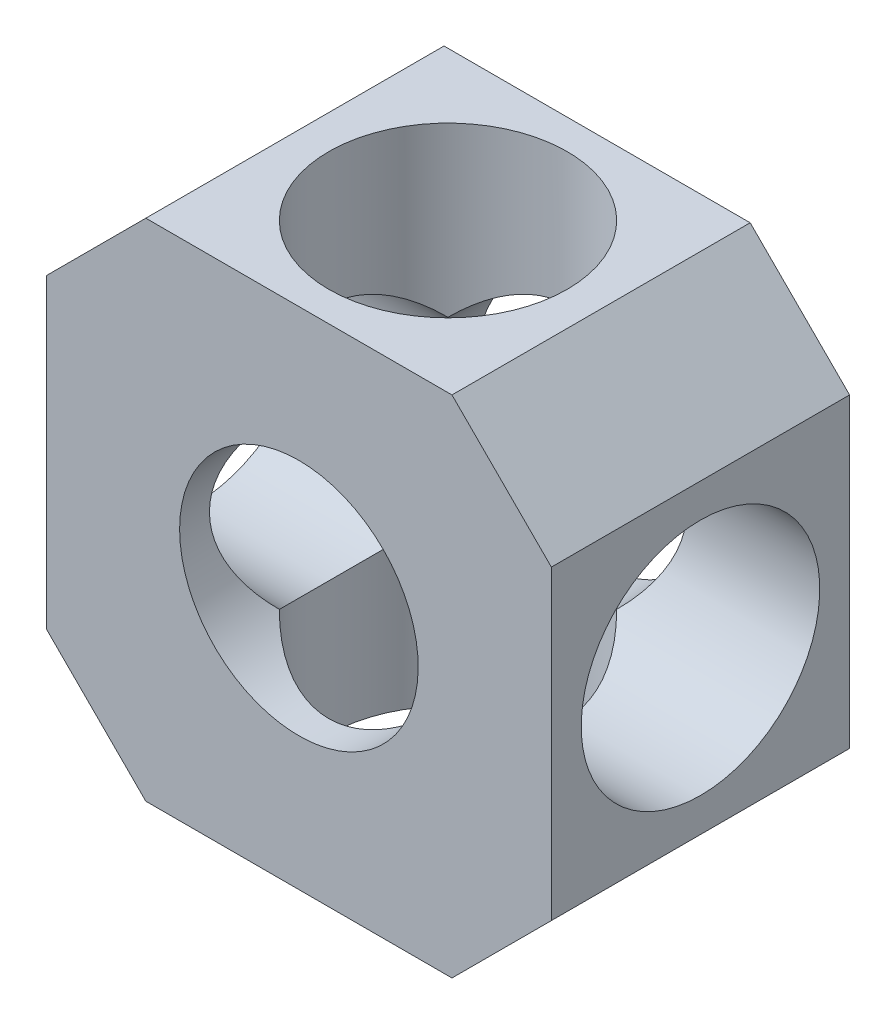
ISO-10303-21;
HEADER;
FILE_DESCRIPTION(('STEP AP214'),'2;1');
FILE_NAME('part.step','',(''),(''),'','','');
FILE_SCHEMA(('AUTOMOTIVE_DESIGN { 1 0 10303 214 1 1 1 1 }'));
ENDSEC;
DATA;
#1=APPLICATION_CONTEXT('core data for automotive mechanical design processes');
#2=APPLICATION_PROTOCOL_DEFINITION('international standard','automotive_design',2000,#1);
#3=PRODUCT_CONTEXT('',#1,'mechanical');
#4=PRODUCT('Part','Part','',(#3));
#5=PRODUCT_RELATED_PRODUCT_CATEGORY('part','',(#4));
#6=PRODUCT_DEFINITION_FORMATION('','',#4);
#7=PRODUCT_DEFINITION_CONTEXT('part definition',#1,'design');
#8=PRODUCT_DEFINITION('design','',#6,#7);
#9=PRODUCT_DEFINITION_SHAPE('','',#8);
#10=(LENGTH_UNIT() NAMED_UNIT(*) SI_UNIT(.MILLI.,.METRE.));
#11=(NAMED_UNIT(*) PLANE_ANGLE_UNIT() SI_UNIT($,.RADIAN.));
#12=(NAMED_UNIT(*) SI_UNIT($,.STERADIAN.) SOLID_ANGLE_UNIT());
#13=UNCERTAINTY_MEASURE_WITH_UNIT(LENGTH_MEASURE(1.E-05),#10,'distance_accuracy_value','');
#14=(GEOMETRIC_REPRESENTATION_CONTEXT(3) GLOBAL_UNCERTAINTY_ASSIGNED_CONTEXT((#13)) GLOBAL_UNIT_ASSIGNED_CONTEXT((#10,
#11,#12)) REPRESENTATION_CONTEXT('',''));
#15=CARTESIAN_POINT('',(0.,0.,0.));
#16=DIRECTION('',(0.,0.,1.));
#17=DIRECTION('',(1.,0.,0.));
#18=AXIS2_PLACEMENT_3D('',#15,#16,#17);
#19=CARTESIAN_POINT('',(0.,0.,-7.5));
#20=DIRECTION('',(0.,0.,1.));
#21=DIRECTION('',(1.,0.,0.));
#22=AXIS2_PLACEMENT_3D('',#19,#20,#21);
#23=CYLINDRICAL_SURFACE('',#22,6.);
#24=CARTESIAN_POINT('',(0.,0.,7.5));
#25=DIRECTION('',(0.,0.,-1.));
#26=DIRECTION('',(-1.,0.,0.));
#27=AXIS2_PLACEMENT_3D('',#24,#25,#26);
#28=CIRCLE('',#27,6.);
#29=CARTESIAN_POINT('',(-6.,0.,7.5));
#30=VERTEX_POINT('',#29);
#31=EDGE_CURVE('E182',#30,#30,#28,.T.);
#32=ORIENTED_EDGE('',*,*,#31,.F.);
#33=EDGE_LOOP('',(#32));
#34=FACE_BOUND('',#33,.T.);
#35=CARTESIAN_POINT('',(0.,0.,0.));
#36=DIRECTION('',(0.707106781186547,0.,0.707106781186548));
#37=DIRECTION('',(-0.707106781186547,0.,0.707106781186548));
#38=AXIS2_PLACEMENT_3D('',#35,#36,#37);
#39=ELLIPSE('',#38,8.48528137423857,6.);
#40=CARTESIAN_POINT('',(-4.24264068711931,-4.24264068711927,4.2426406871193));
#41=VERTEX_POINT('',#40);
#42=CARTESIAN_POINT('',(-4.24264068711926,4.2426406871193,4.24264068711927));
#43=VERTEX_POINT('',#42);
#44=EDGE_CURVE('E137',#41,#43,#39,.F.);
#45=ORIENTED_EDGE('',*,*,#44,.T.);
#46=CARTESIAN_POINT('',(0.,0.,0.));
#47=DIRECTION('',(0.,-0.707106781186547,0.707106781186547));
#48=DIRECTION('',(0.,0.707106781186547,0.707106781186547));
#49=AXIS2_PLACEMENT_3D('',#46,#47,#48);
#50=ELLIPSE('',#49,8.48528137423857,6.);
#51=CARTESIAN_POINT('',(4.24264068711931,4.24264068711927,4.2426406871193));
#52=VERTEX_POINT('',#51);
#53=EDGE_CURVE('E171',#43,#52,#50,.F.);
#54=ORIENTED_EDGE('',*,*,#53,.T.);
#55=CARTESIAN_POINT('',(0.,0.,0.));
#56=DIRECTION('',(-0.707106781186547,0.,0.707106781186548));
#57=DIRECTION('',(0.707106781186547,0.,0.707106781186548));
#58=AXIS2_PLACEMENT_3D('',#55,#56,#57);
#59=ELLIPSE('',#58,8.48528137423857,6.);
#60=CARTESIAN_POINT('',(4.24264068711928,-4.24264068711929,4.24264068711928));
#61=VERTEX_POINT('',#60);
#62=EDGE_CURVE('E139',#52,#61,#59,.F.);
#63=ORIENTED_EDGE('',*,*,#62,.T.);
#64=CARTESIAN_POINT('',(0.,0.,0.));
#65=DIRECTION('',(0.,0.707106781186547,0.707106781186547));
#66=DIRECTION('',(0.,-0.707106781186547,0.707106781186547));
#67=AXIS2_PLACEMENT_3D('',#64,#65,#66);
#68=ELLIPSE('',#67,8.48528137423857,6.);
#69=EDGE_CURVE('E52',#61,#41,#68,.F.);
#70=ORIENTED_EDGE('',*,*,#69,.T.);
#71=EDGE_LOOP('',(#45,#54,#63,#70));
#72=FACE_BOUND('',#71,.T.);
#73=ADVANCED_FACE('F36',(#34,#72),#23,.F.);
#74=CARTESIAN_POINT('',(-12.7,12.7,7.5));
#75=DIRECTION('',(1.,0.,0.));
#76=DIRECTION('',(0.,1.,0.));
#77=AXIS2_PLACEMENT_3D('',#74,#75,#76);
#78=PLANE('',#77);
#79=CARTESIAN_POINT('',(-12.7,0.,0.));
#80=DIRECTION('',(1.,0.,0.));
#81=DIRECTION('',(0.,1.,0.));
#82=AXIS2_PLACEMENT_3D('',#79,#80,#81);
#83=CIRCLE('',#82,6.);
#84=CARTESIAN_POINT('',(-12.7,6.,0.));
#85=VERTEX_POINT('',#84);
#86=EDGE_CURVE('E176',#85,#85,#83,.T.);
#87=ORIENTED_EDGE('',*,*,#86,.T.);
#88=EDGE_LOOP('',(#87));
#89=FACE_BOUND('',#88,.T.);
#90=DIRECTION('',(0.,-1.,0.));
#91=VECTOR('',#90,1.);
#92=CARTESIAN_POINT('',(-12.7,12.7,-7.5));
#93=LINE('',#92,#91);
#94=CARTESIAN_POINT('',(-12.7,7.69999999999997,-7.5));
#95=VERTEX_POINT('',#94);
#96=CARTESIAN_POINT('',(-12.7,-7.69999999999999,-7.5));
#97=VERTEX_POINT('',#96);
#98=EDGE_CURVE('E185',#95,#97,#93,.T.);
#99=ORIENTED_EDGE('',*,*,#98,.T.);
#100=DIRECTION('',(0.,0.,1.));
#101=VECTOR('',#100,1.);
#102=CARTESIAN_POINT('',(-12.7,-7.69999999999999,7.5));
#103=LINE('',#102,#101);
#104=CARTESIAN_POINT('',(-12.7,-7.69999999999999,7.5));
#105=VERTEX_POINT('',#104);
#106=EDGE_CURVE('E225',#97,#105,#103,.T.);
#107=ORIENTED_EDGE('',*,*,#106,.T.);
#108=DIRECTION('',(0.,-1.,0.));
#109=VECTOR('',#108,1.);
#110=CARTESIAN_POINT('',(-12.7,12.7,7.5));
#111=LINE('',#110,#109);
#112=CARTESIAN_POINT('',(-12.7,7.69999999999997,7.5));
#113=VERTEX_POINT('',#112);
#114=EDGE_CURVE('E186',#113,#105,#111,.T.);
#115=ORIENTED_EDGE('',*,*,#114,.F.);
#116=DIRECTION('',(0.,0.,-1.));
#117=VECTOR('',#116,1.);
#118=CARTESIAN_POINT('',(-12.7,7.69999999999997,7.5));
#119=LINE('',#118,#117);
#120=EDGE_CURVE('E222',#113,#95,#119,.T.);
#121=ORIENTED_EDGE('',*,*,#120,.T.);
#122=EDGE_LOOP('',(#99,#107,#115,#121));
#123=FACE_BOUND('',#122,.T.);
#124=ADVANCED_FACE('F259',(#89,#123),#78,.F.);
#125=CARTESIAN_POINT('',(12.7,-12.7,7.5));
#126=DIRECTION('',(0.,1.,0.));
#127=DIRECTION('',(-1.,0.,0.));
#128=AXIS2_PLACEMENT_3D('',#125,#126,#127);
#129=PLANE('',#128);
#130=CARTESIAN_POINT('',(0.,-12.7,0.));
#131=DIRECTION('',(0.,1.,0.));
#132=DIRECTION('',(-1.,0.,0.));
#133=AXIS2_PLACEMENT_3D('',#130,#131,#132);
#134=CIRCLE('',#133,6.);
#135=CARTESIAN_POINT('',(-6.00000000000004,-12.7,0.));
#136=VERTEX_POINT('',#135);
#137=EDGE_CURVE('E140',#136,#136,#134,.T.);
#138=ORIENTED_EDGE('',*,*,#137,.T.);
#139=EDGE_LOOP('',(#138));
#140=FACE_BOUND('',#139,.T.);
#141=DIRECTION('',(1.,0.,0.));
#142=VECTOR('',#141,1.);
#143=CARTESIAN_POINT('',(12.7,-12.7,7.5));
#144=LINE('',#143,#142);
#145=CARTESIAN_POINT('',(-7.69999999999997,-12.7,7.5));
#146=VERTEX_POINT('',#145);
#147=CARTESIAN_POINT('',(7.69999999999999,-12.7,7.5));
#148=VERTEX_POINT('',#147);
#149=EDGE_CURVE('E189',#146,#148,#144,.T.);
#150=ORIENTED_EDGE('',*,*,#149,.F.);
#151=DIRECTION('',(0.,0.,-1.));
#152=VECTOR('',#151,1.);
#153=CARTESIAN_POINT('',(-7.69999999999997,-12.7,7.5));
#154=LINE('',#153,#152);
#155=CARTESIAN_POINT('',(-7.69999999999997,-12.7,-7.5));
#156=VERTEX_POINT('',#155);
#157=EDGE_CURVE('E211',#146,#156,#154,.T.);
#158=ORIENTED_EDGE('',*,*,#157,.T.);
#159=DIRECTION('',(1.,0.,0.));
#160=VECTOR('',#159,1.);
#161=CARTESIAN_POINT('',(12.7,-12.7,-7.5));
#162=LINE('',#161,#160);
#163=CARTESIAN_POINT('',(7.69999999999999,-12.7,-7.5));
#164=VERTEX_POINT('',#163);
#165=EDGE_CURVE('E202',#156,#164,#162,.T.);
#166=ORIENTED_EDGE('',*,*,#165,.T.);
#167=DIRECTION('',(0.,0.,1.));
#168=VECTOR('',#167,1.);
#169=CARTESIAN_POINT('',(7.69999999999999,-12.7,7.5));
#170=LINE('',#169,#168);
#171=EDGE_CURVE('E199',#164,#148,#170,.T.);
#172=ORIENTED_EDGE('',*,*,#171,.T.);
#173=EDGE_LOOP('',(#150,#158,#166,#172));
#174=FACE_BOUND('',#173,.T.);
#175=ADVANCED_FACE('F269',(#140,#174),#129,.F.);
#176=CARTESIAN_POINT('',(12.7,12.7,7.5));
#177=DIRECTION('',(-1.,0.,0.));
#178=DIRECTION('',(0.,-1.,0.));
#179=AXIS2_PLACEMENT_3D('',#176,#177,#178);
#180=PLANE('',#179);
#181=CARTESIAN_POINT('',(12.7,0.,0.));
#182=DIRECTION('',(-1.,0.,0.));
#183=DIRECTION('',(0.,-1.,0.));
#184=AXIS2_PLACEMENT_3D('',#181,#182,#183);
#185=CIRCLE('',#184,6.);
#186=CARTESIAN_POINT('',(12.7,-6.,0.));
#187=VERTEX_POINT('',#186);
#188=EDGE_CURVE('E173',#187,#187,#185,.T.);
#189=ORIENTED_EDGE('',*,*,#188,.T.);
#190=EDGE_LOOP('',(#189));
#191=FACE_BOUND('',#190,.T.);
#192=DIRECTION('',(0.,1.,0.));
#193=VECTOR('',#192,1.);
#194=CARTESIAN_POINT('',(12.7,12.7,7.5));
#195=LINE('',#194,#193);
#196=CARTESIAN_POINT('',(12.7,-7.69999999999999,7.5));
#197=VERTEX_POINT('',#196);
#198=CARTESIAN_POINT('',(12.7,7.69999999999999,7.5));
#199=VERTEX_POINT('',#198);
#200=EDGE_CURVE('E193',#197,#199,#195,.T.);
#201=ORIENTED_EDGE('',*,*,#200,.F.);
#202=DIRECTION('',(0.,0.,-1.));
#203=VECTOR('',#202,1.);
#204=CARTESIAN_POINT('',(12.7,-7.69999999999999,7.5));
#205=LINE('',#204,#203);
#206=CARTESIAN_POINT('',(12.7,-7.69999999999999,-7.5));
#207=VERTEX_POINT('',#206);
#208=EDGE_CURVE('E237',#197,#207,#205,.T.);
#209=ORIENTED_EDGE('',*,*,#208,.T.);
#210=DIRECTION('',(0.,1.,0.));
#211=VECTOR('',#210,1.);
#212=CARTESIAN_POINT('',(12.7,12.7,-7.5));
#213=LINE('',#212,#211);
#214=CARTESIAN_POINT('',(12.7,7.69999999999999,-7.5));
#215=VERTEX_POINT('',#214);
#216=EDGE_CURVE('E205',#207,#215,#213,.T.);
#217=ORIENTED_EDGE('',*,*,#216,.T.);
#218=DIRECTION('',(0.,0.,1.));
#219=VECTOR('',#218,1.);
#220=CARTESIAN_POINT('',(12.7,7.69999999999999,7.5));
#221=LINE('',#220,#219);
#222=EDGE_CURVE('E235',#215,#199,#221,.T.);
#223=ORIENTED_EDGE('',*,*,#222,.T.);
#224=EDGE_LOOP('',(#201,#209,#217,#223));
#225=FACE_BOUND('',#224,.T.);
#226=ADVANCED_FACE('F277',(#191,#225),#180,.F.);
#227=CARTESIAN_POINT('',(12.7,12.7,7.5));
#228=DIRECTION('',(0.,-1.,0.));
#229=DIRECTION('',(1.,0.,0.));
#230=AXIS2_PLACEMENT_3D('',#227,#228,#229);
#231=PLANE('',#230);
#232=CARTESIAN_POINT('',(0.,12.7,0.));
#233=DIRECTION('',(0.,-1.,0.));
#234=DIRECTION('',(1.,0.,0.));
#235=AXIS2_PLACEMENT_3D('',#232,#233,#234);
#236=CIRCLE('',#235,6.);
#237=CARTESIAN_POINT('',(6.00000000000004,12.7,0.));
#238=VERTEX_POINT('',#237);
#239=EDGE_CURVE('E168',#238,#238,#236,.T.);
#240=ORIENTED_EDGE('',*,*,#239,.T.);
#241=EDGE_LOOP('',(#240));
#242=FACE_BOUND('',#241,.T.);
#243=DIRECTION('',(-1.,0.,0.));
#244=VECTOR('',#243,1.);
#245=CARTESIAN_POINT('',(12.7,12.7,-7.5));
#246=LINE('',#245,#244);
#247=CARTESIAN_POINT('',(7.69999999999999,12.7,-7.5));
#248=VERTEX_POINT('',#247);
#249=CARTESIAN_POINT('',(-7.69999999999998,12.7,-7.5));
#250=VERTEX_POINT('',#249);
#251=EDGE_CURVE('E190',#248,#250,#246,.T.);
#252=ORIENTED_EDGE('',*,*,#251,.T.);
#253=DIRECTION('',(0.,0.,1.));
#254=VECTOR('',#253,1.);
#255=CARTESIAN_POINT('',(-7.69999999999998,12.7,7.5));
#256=LINE('',#255,#254);
#257=CARTESIAN_POINT('',(-7.69999999999998,12.7,7.5));
#258=VERTEX_POINT('',#257);
#259=EDGE_CURVE('E146',#250,#258,#256,.T.);
#260=ORIENTED_EDGE('',*,*,#259,.T.);
#261=DIRECTION('',(-1.,0.,0.));
#262=VECTOR('',#261,1.);
#263=CARTESIAN_POINT('',(12.7,12.7,7.5));
#264=LINE('',#263,#262);
#265=CARTESIAN_POINT('',(7.69999999999999,12.7,7.5));
#266=VERTEX_POINT('',#265);
#267=EDGE_CURVE('E196',#266,#258,#264,.T.);
#268=ORIENTED_EDGE('',*,*,#267,.F.);
#269=DIRECTION('',(0.,0.,-1.));
#270=VECTOR('',#269,1.);
#271=CARTESIAN_POINT('',(7.69999999999999,12.7,7.5));
#272=LINE('',#271,#270);
#273=EDGE_CURVE('E151',#266,#248,#272,.T.);
#274=ORIENTED_EDGE('',*,*,#273,.T.);
#275=EDGE_LOOP('',(#252,#260,#268,#274));
#276=FACE_BOUND('',#275,.T.);
#277=ADVANCED_FACE('F244',(#242,#276),#231,.F.);
#278=CARTESIAN_POINT('',(0.,0.,7.5));
#279=DIRECTION('',(0.,0.,-1.));
#280=DIRECTION('',(-1.,0.,0.));
#281=AXIS2_PLACEMENT_3D('',#278,#279,#280);
#282=PLANE('',#281);
#283=ORIENTED_EDGE('',*,*,#31,.T.);
#284=EDGE_LOOP('',(#283));
#285=FACE_BOUND('',#284,.T.);
#286=ORIENTED_EDGE('',*,*,#114,.T.);
#287=DIRECTION('',(-0.707106781186549,0.707106781186547,0.));
#288=VECTOR('',#287,1.);
#289=CARTESIAN_POINT('',(-7.69999999999997,-12.7,7.5));
#290=LINE('',#289,#288);
#291=EDGE_CURVE('E233',#105,#146,#290,.F.);
#292=ORIENTED_EDGE('',*,*,#291,.T.);
#293=ORIENTED_EDGE('',*,*,#149,.T.);
#294=DIRECTION('',(-0.707106781186548,-0.707106781186547,0.));
#295=VECTOR('',#294,1.);
#296=CARTESIAN_POINT('',(12.7,-7.69999999999999,7.5));
#297=LINE('',#296,#295);
#298=EDGE_CURVE('E231',#148,#197,#297,.F.);
#299=ORIENTED_EDGE('',*,*,#298,.T.);
#300=ORIENTED_EDGE('',*,*,#200,.T.);
#301=DIRECTION('',(0.707106781186547,-0.707106781186548,0.));
#302=VECTOR('',#301,1.);
#303=CARTESIAN_POINT('',(7.69999999999999,12.7,7.5));
#304=LINE('',#303,#302);
#305=EDGE_CURVE('E227',#199,#266,#304,.F.);
#306=ORIENTED_EDGE('',*,*,#305,.T.);
#307=ORIENTED_EDGE('',*,*,#267,.T.);
#308=DIRECTION('',(0.707106781186547,0.707106781186548,0.));
#309=VECTOR('',#308,1.);
#310=CARTESIAN_POINT('',(-12.7,7.69999999999997,7.5));
#311=LINE('',#310,#309);
#312=EDGE_CURVE('E229',#258,#113,#311,.F.);
#313=ORIENTED_EDGE('',*,*,#312,.T.);
#314=EDGE_LOOP('',(#286,#292,#293,#299,#300,#306,#307,#313));
#315=FACE_BOUND('',#314,.T.);
#316=ADVANCED_FACE('F263',(#285,#315),#282,.F.);
#317=CARTESIAN_POINT('',(0.,0.,-7.5));
#318=DIRECTION('',(0.,0.,-1.));
#319=DIRECTION('',(-1.,0.,0.));
#320=AXIS2_PLACEMENT_3D('',#317,#318,#319);
#321=PLANE('',#320);
#322=CARTESIAN_POINT('',(0.,0.,-7.5));
#323=DIRECTION('',(0.,0.,1.));
#324=DIRECTION('',(1.,0.,0.));
#325=AXIS2_PLACEMENT_3D('',#322,#323,#324);
#326=CIRCLE('',#325,6.);
#327=CARTESIAN_POINT('',(6.,0.,-7.5));
#328=VERTEX_POINT('',#327);
#329=EDGE_CURVE('E179',#328,#328,#326,.T.);
#330=ORIENTED_EDGE('',*,*,#329,.T.);
#331=EDGE_LOOP('',(#330));
#332=FACE_BOUND('',#331,.T.);
#333=ORIENTED_EDGE('',*,*,#165,.F.);
#334=DIRECTION('',(0.707106781186549,-0.707106781186547,0.));
#335=VECTOR('',#334,1.);
#336=CARTESIAN_POINT('',(-10.2,-10.2,-7.5));
#337=LINE('',#336,#335);
#338=EDGE_CURVE('E220',#156,#97,#337,.F.);
#339=ORIENTED_EDGE('',*,*,#338,.T.);
#340=ORIENTED_EDGE('',*,*,#98,.F.);
#341=DIRECTION('',(-0.707106781186547,-0.707106781186548,0.));
#342=VECTOR('',#341,1.);
#343=CARTESIAN_POINT('',(-10.2,10.2,-7.5));
#344=LINE('',#343,#342);
#345=EDGE_CURVE('E216',#95,#250,#344,.F.);
#346=ORIENTED_EDGE('',*,*,#345,.T.);
#347=ORIENTED_EDGE('',*,*,#251,.F.);
#348=DIRECTION('',(-0.707106781186547,0.707106781186548,0.));
#349=VECTOR('',#348,1.);
#350=CARTESIAN_POINT('',(10.2,10.2,-7.5));
#351=LINE('',#350,#349);
#352=EDGE_CURVE('E214',#248,#215,#351,.F.);
#353=ORIENTED_EDGE('',*,*,#352,.T.);
#354=ORIENTED_EDGE('',*,*,#216,.F.);
#355=DIRECTION('',(0.707106781186548,0.707106781186547,0.));
#356=VECTOR('',#355,1.);
#357=CARTESIAN_POINT('',(10.2,-10.2,-7.5));
#358=LINE('',#357,#356);
#359=EDGE_CURVE('E218',#207,#164,#358,.F.);
#360=ORIENTED_EDGE('',*,*,#359,.T.);
#361=EDGE_LOOP('',(#333,#339,#340,#346,#347,#353,#354,#360));
#362=FACE_BOUND('',#361,.T.);
#363=ADVANCED_FACE('F250',(#332,#362),#321,.T.);
#364=CARTESIAN_POINT('',(-7.69999999999997,-12.7,7.5));
#365=DIRECTION('',(0.707106781186547,0.707106781186549,0.));
#366=DIRECTION('',(0.,0.,-1.));
#367=AXIS2_PLACEMENT_3D('',#364,#365,#366);
#368=PLANE('',#367);
#369=ORIENTED_EDGE('',*,*,#291,.F.);
#370=ORIENTED_EDGE('',*,*,#106,.F.);
#371=ORIENTED_EDGE('',*,*,#338,.F.);
#372=ORIENTED_EDGE('',*,*,#157,.F.);
#373=EDGE_LOOP('',(#369,#370,#371,#372));
#374=FACE_BOUND('',#373,.T.);
#375=ADVANCED_FACE('F267',(#374),#368,.F.);
#376=CARTESIAN_POINT('',(12.7,-7.69999999999999,7.5));
#377=DIRECTION('',(-0.707106781186547,0.707106781186548,0.));
#378=DIRECTION('',(0.,0.,-1.));
#379=AXIS2_PLACEMENT_3D('',#376,#377,#378);
#380=PLANE('',#379);
#381=ORIENTED_EDGE('',*,*,#298,.F.);
#382=ORIENTED_EDGE('',*,*,#171,.F.);
#383=ORIENTED_EDGE('',*,*,#359,.F.);
#384=ORIENTED_EDGE('',*,*,#208,.F.);
#385=EDGE_LOOP('',(#381,#382,#383,#384));
#386=FACE_BOUND('',#385,.T.);
#387=ADVANCED_FACE('F274',(#386),#380,.F.);
#388=CARTESIAN_POINT('',(-12.7,7.69999999999997,7.5));
#389=DIRECTION('',(0.707106781186548,-0.707106781186547,0.));
#390=DIRECTION('',(0.,0.,-1.));
#391=AXIS2_PLACEMENT_3D('',#388,#389,#390);
#392=PLANE('',#391);
#393=ORIENTED_EDGE('',*,*,#312,.F.);
#394=ORIENTED_EDGE('',*,*,#259,.F.);
#395=ORIENTED_EDGE('',*,*,#345,.F.);
#396=ORIENTED_EDGE('',*,*,#120,.F.);
#397=EDGE_LOOP('',(#393,#394,#395,#396));
#398=FACE_BOUND('',#397,.T.);
#399=ADVANCED_FACE('F256',(#398),#392,.F.);
#400=CARTESIAN_POINT('',(7.69999999999999,12.7,7.5));
#401=DIRECTION('',(-0.707106781186548,-0.707106781186547,0.));
#402=DIRECTION('',(0.,0.,-1.));
#403=AXIS2_PLACEMENT_3D('',#400,#401,#402);
#404=PLANE('',#403);
#405=ORIENTED_EDGE('',*,*,#305,.F.);
#406=ORIENTED_EDGE('',*,*,#222,.F.);
#407=ORIENTED_EDGE('',*,*,#352,.F.);
#408=ORIENTED_EDGE('',*,*,#273,.F.);
#409=EDGE_LOOP('',(#405,#406,#407,#408));
#410=FACE_BOUND('',#409,.T.);
#411=ADVANCED_FACE('F39',(#410),#404,.F.);
#412=CARTESIAN_POINT('',(0.,0.,0.));
#413=DIRECTION('',(0.707106781186547,0.,0.707106781186548));
#414=DIRECTION('',(-0.707106781186547,0.,0.707106781186548));
#415=AXIS2_PLACEMENT_3D('',#412,#413,#414);
#416=ELLIPSE('',#415,8.48528137423857,6.);
#417=CARTESIAN_POINT('',(4.24264068711926,-4.2426406871193,-4.24264068711927));
#418=VERTEX_POINT('',#417);
#419=CARTESIAN_POINT('',(4.24264068711929,4.24264068711928,-4.24264068711929));
#420=VERTEX_POINT('',#419);
#421=EDGE_CURVE('E145',#418,#420,#416,.T.);
#422=ORIENTED_EDGE('',*,*,#421,.T.);
#423=CARTESIAN_POINT('',(0.,0.,0.));
#424=DIRECTION('',(0.,0.707106781186547,0.707106781186547));
#425=DIRECTION('',(0.,-0.707106781186547,0.707106781186547));
#426=AXIS2_PLACEMENT_3D('',#423,#424,#425);
#427=ELLIPSE('',#426,8.48528137423857,6.);
#428=CARTESIAN_POINT('',(-4.24264068711926,4.2426406871193,-4.24264068711927));
#429=VERTEX_POINT('',#428);
#430=EDGE_CURVE('E60',#420,#429,#427,.T.);
#431=ORIENTED_EDGE('',*,*,#430,.T.);
#432=CARTESIAN_POINT('',(0.,0.,0.));
#433=DIRECTION('',(-0.707106781186547,0.,0.707106781186548));
#434=DIRECTION('',(0.707106781186547,0.,0.707106781186548));
#435=AXIS2_PLACEMENT_3D('',#432,#433,#434);
#436=ELLIPSE('',#435,8.48528137423857,6.);
#437=CARTESIAN_POINT('',(-4.24264068711931,-4.24264068711927,-4.2426406871193));
#438=VERTEX_POINT('',#437);
#439=EDGE_CURVE('E149',#429,#438,#436,.T.);
#440=ORIENTED_EDGE('',*,*,#439,.T.);
#441=CARTESIAN_POINT('',(0.,0.,0.));
#442=DIRECTION('',(0.,-0.707106781186547,0.707106781186547));
#443=DIRECTION('',(0.,0.707106781186547,0.707106781186547));
#444=AXIS2_PLACEMENT_3D('',#441,#442,#443);
#445=ELLIPSE('',#444,8.48528137423857,6.);
#446=EDGE_CURVE('E126',#438,#418,#445,.T.);
#447=ORIENTED_EDGE('',*,*,#446,.T.);
#448=EDGE_LOOP('',(#422,#431,#440,#447));
#449=FACE_BOUND('',#448,.T.);
#450=ORIENTED_EDGE('',*,*,#329,.F.);
#451=EDGE_LOOP('',(#450));
#452=FACE_BOUND('',#451,.T.);
#453=ADVANCED_FACE('F160',(#449,#452),#23,.F.);
#454=CARTESIAN_POINT('',(12.7,0.,0.));
#455=DIRECTION('',(-1.,0.,0.));
#456=DIRECTION('',(0.,-1.,0.));
#457=AXIS2_PLACEMENT_3D('',#454,#455,#456);
#458=CYLINDRICAL_SURFACE('',#457,6.);
#459=ORIENTED_EDGE('',*,*,#439,.F.);
#460=CARTESIAN_POINT('',(0.,0.,0.));
#461=DIRECTION('',(0.707106781186551,0.707106781186544,0.));
#462=DIRECTION('',(0.707106781186544,-0.707106781186551,0.));
#463=AXIS2_PLACEMENT_3D('',#460,#461,#462);
#464=ELLIPSE('',#463,8.48528137423853,6.);
#465=EDGE_CURVE('E131',#429,#43,#464,.T.);
#466=ORIENTED_EDGE('',*,*,#465,.T.);
#467=ORIENTED_EDGE('',*,*,#44,.F.);
#468=CARTESIAN_POINT('',(0.,0.,0.));
#469=DIRECTION('',(0.707106781186544,-0.707106781186551,0.));
#470=DIRECTION('',(0.707106781186551,0.707106781186544,0.));
#471=AXIS2_PLACEMENT_3D('',#468,#469,#470);
#472=ELLIPSE('',#471,8.48528137423862,6.);
#473=EDGE_CURVE('E123',#41,#438,#472,.T.);
#474=ORIENTED_EDGE('',*,*,#473,.T.);
#475=EDGE_LOOP('',(#459,#466,#467,#474));
#476=FACE_BOUND('',#475,.T.);
#477=ORIENTED_EDGE('',*,*,#86,.F.);
#478=EDGE_LOOP('',(#477));
#479=FACE_BOUND('',#478,.T.);
#480=ADVANCED_FACE('F143',(#476,#479),#458,.F.);
#481=ORIENTED_EDGE('',*,*,#188,.F.);
#482=EDGE_LOOP('',(#481));
#483=FACE_BOUND('',#482,.T.);
#484=ORIENTED_EDGE('',*,*,#62,.F.);
#485=CARTESIAN_POINT('',(0.,0.,0.));
#486=DIRECTION('',(-0.707106781186546,0.707106781186549,0.));
#487=DIRECTION('',(-0.707106781186549,-0.707106781186546,0.));
#488=AXIS2_PLACEMENT_3D('',#485,#486,#487);
#489=ELLIPSE('',#488,8.48528137423859,6.);
#490=EDGE_CURVE('E11',#52,#420,#489,.T.);
#491=ORIENTED_EDGE('',*,*,#490,.T.);
#492=ORIENTED_EDGE('',*,*,#421,.F.);
#493=CARTESIAN_POINT('',(0.,0.,0.));
#494=DIRECTION('',(-0.707106781186549,-0.707106781186546,0.));
#495=DIRECTION('',(-0.707106781186546,0.707106781186549,0.));
#496=AXIS2_PLACEMENT_3D('',#493,#494,#495);
#497=ELLIPSE('',#496,8.48528137423856,6.);
#498=EDGE_CURVE('E45',#418,#61,#497,.T.);
#499=ORIENTED_EDGE('',*,*,#498,.T.);
#500=EDGE_LOOP('',(#484,#491,#492,#499));
#501=FACE_BOUND('',#500,.T.);
#502=ADVANCED_FACE('F158',(#483,#501),#458,.F.);
#503=CARTESIAN_POINT('',(0.,-12.7,0.));
#504=DIRECTION('',(0.,1.,0.));
#505=DIRECTION('',(-1.,0.,0.));
#506=AXIS2_PLACEMENT_3D('',#503,#504,#505);
#507=CYLINDRICAL_SURFACE('',#506,6.);
#508=ORIENTED_EDGE('',*,*,#137,.F.);
#509=EDGE_LOOP('',(#508));
#510=FACE_BOUND('',#509,.T.);
#511=ORIENTED_EDGE('',*,*,#498,.F.);
#512=ORIENTED_EDGE('',*,*,#446,.F.);
#513=ORIENTED_EDGE('',*,*,#473,.F.);
#514=ORIENTED_EDGE('',*,*,#69,.F.);
#515=EDGE_LOOP('',(#511,#512,#513,#514));
#516=FACE_BOUND('',#515,.T.);
#517=ADVANCED_FACE('F124',(#510,#516),#507,.F.);
#518=ORIENTED_EDGE('',*,*,#239,.F.);
#519=EDGE_LOOP('',(#518));
#520=FACE_BOUND('',#519,.T.);
#521=ORIENTED_EDGE('',*,*,#465,.F.);
#522=ORIENTED_EDGE('',*,*,#430,.F.);
#523=ORIENTED_EDGE('',*,*,#490,.F.);
#524=ORIENTED_EDGE('',*,*,#53,.F.);
#525=EDGE_LOOP('',(#521,#522,#523,#524));
#526=FACE_BOUND('',#525,.T.);
#527=ADVANCED_FACE('F409',(#520,#526),#507,.F.);
#528=CLOSED_SHELL('',(#73,#124,#175,#226,#277,#316,#363,#375,#387,#399,#411,#453,#480,#502,#517,#527));
#529=MANIFOLD_SOLID_BREP('B2',#528);
#530=ADVANCED_BREP_SHAPE_REPRESENTATION('',(#18,#529),#14);
#531=SHAPE_DEFINITION_REPRESENTATION(#9,#530);
ENDSEC;
END-ISO-10303-21;
